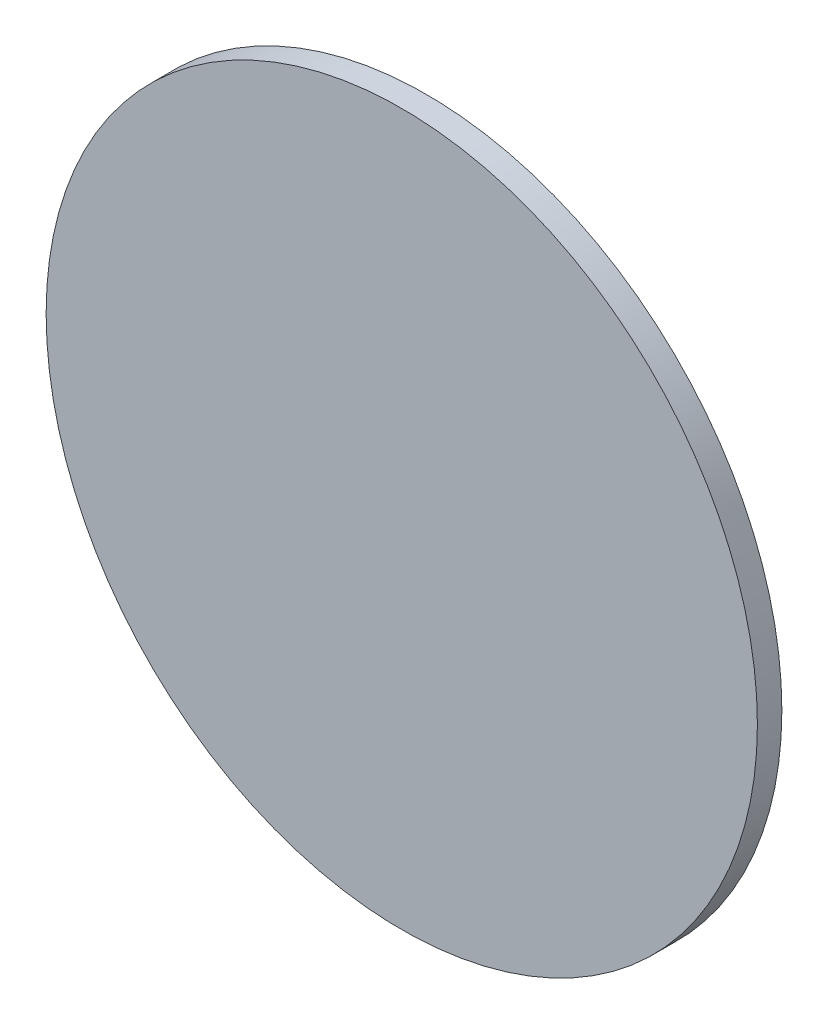
ISO-10303-21;
HEADER;
FILE_DESCRIPTION(('STEP AP214'),'2;1');
FILE_NAME('part.step','',(''),(''),'','','');
FILE_SCHEMA(('AUTOMOTIVE_DESIGN { 1 0 10303 214 1 1 1 1 }'));
ENDSEC;
DATA;
#1=APPLICATION_CONTEXT('core data for automotive mechanical design processes');
#2=APPLICATION_PROTOCOL_DEFINITION('international standard','automotive_design',2000,#1);
#3=PRODUCT_CONTEXT('',#1,'mechanical');
#4=PRODUCT('Part','Part','',(#3));
#5=PRODUCT_RELATED_PRODUCT_CATEGORY('part','',(#4));
#6=PRODUCT_DEFINITION_FORMATION('','',#4);
#7=PRODUCT_DEFINITION_CONTEXT('part definition',#1,'design');
#8=PRODUCT_DEFINITION('design','',#6,#7);
#9=PRODUCT_DEFINITION_SHAPE('','',#8);
#10=(LENGTH_UNIT() NAMED_UNIT(*) SI_UNIT(.MILLI.,.METRE.));
#11=(NAMED_UNIT(*) PLANE_ANGLE_UNIT() SI_UNIT($,.RADIAN.));
#12=(NAMED_UNIT(*) SI_UNIT($,.STERADIAN.) SOLID_ANGLE_UNIT());
#13=UNCERTAINTY_MEASURE_WITH_UNIT(LENGTH_MEASURE(1.E-05),#10,'distance_accuracy_value','');
#14=(GEOMETRIC_REPRESENTATION_CONTEXT(3) GLOBAL_UNCERTAINTY_ASSIGNED_CONTEXT((#13)) GLOBAL_UNIT_ASSIGNED_CONTEXT((#10,
#11,#12)) REPRESENTATION_CONTEXT('',''));
#15=CARTESIAN_POINT('',(0.,0.,0.));
#16=DIRECTION('',(0.,0.,1.));
#17=DIRECTION('',(1.,0.,0.));
#18=AXIS2_PLACEMENT_3D('',#15,#16,#17);
#19=CARTESIAN_POINT('',(0.,0.,2.54));
#20=DIRECTION('',(0.,0.,-1.));
#21=DIRECTION('',(-1.,0.,0.));
#22=AXIS2_PLACEMENT_3D('',#19,#20,#21);
#23=CYLINDRICAL_SURFACE('',#22,36.9191318352864);
#24=CARTESIAN_POINT('',(0.,0.,2.54));
#25=DIRECTION('',(0.,0.,1.));
#26=DIRECTION('',(1.,0.,0.));
#27=AXIS2_PLACEMENT_3D('',#24,#25,#26);
#28=CIRCLE('',#27,36.9191318352864);
#29=CARTESIAN_POINT('',(36.9191318352864,0.,2.54));
#30=VERTEX_POINT('',#29);
#31=EDGE_CURVE('E10',#30,#30,#28,.T.);
#32=ORIENTED_EDGE('',*,*,#31,.F.);
#33=EDGE_LOOP('',(#32));
#34=FACE_BOUND('',#33,.T.);
#35=CARTESIAN_POINT('',(0.,0.,0.));
#36=DIRECTION('',(0.,0.,1.));
#37=DIRECTION('',(1.,0.,0.));
#38=AXIS2_PLACEMENT_3D('',#35,#36,#37);
#39=CIRCLE('',#38,36.9191318352864);
#40=CARTESIAN_POINT('',(36.9191318352864,0.,0.));
#41=VERTEX_POINT('',#40);
#42=EDGE_CURVE('E34',#41,#41,#39,.T.);
#43=ORIENTED_EDGE('',*,*,#42,.T.);
#44=EDGE_LOOP('',(#43));
#45=FACE_BOUND('',#44,.T.);
#46=ADVANCED_FACE('F31',(#34,#45),#23,.T.);
#47=CARTESIAN_POINT('',(0.,0.,2.54));
#48=DIRECTION('',(0.,0.,1.));
#49=DIRECTION('',(1.,0.,0.));
#50=AXIS2_PLACEMENT_3D('',#47,#48,#49);
#51=PLANE('',#50);
#52=ORIENTED_EDGE('',*,*,#31,.T.);
#53=EDGE_LOOP('',(#52));
#54=FACE_BOUND('',#53,.T.);
#55=ADVANCED_FACE('F46',(#54),#51,.T.);
#56=CARTESIAN_POINT('',(0.,0.,0.));
#57=DIRECTION('',(0.,0.,1.));
#58=DIRECTION('',(1.,0.,0.));
#59=AXIS2_PLACEMENT_3D('',#56,#57,#58);
#60=PLANE('',#59);
#61=ORIENTED_EDGE('',*,*,#42,.F.);
#62=EDGE_LOOP('',(#61));
#63=FACE_BOUND('',#62,.T.);
#64=ADVANCED_FACE('F44',(#63),#60,.F.);
#65=CLOSED_SHELL('',(#46,#55,#64));
#66=MANIFOLD_SOLID_BREP('B2',#65);
#67=ADVANCED_BREP_SHAPE_REPRESENTATION('',(#18,#66),#14);
#68=SHAPE_DEFINITION_REPRESENTATION(#9,#67);
ENDSEC;
END-ISO-10303-21;
